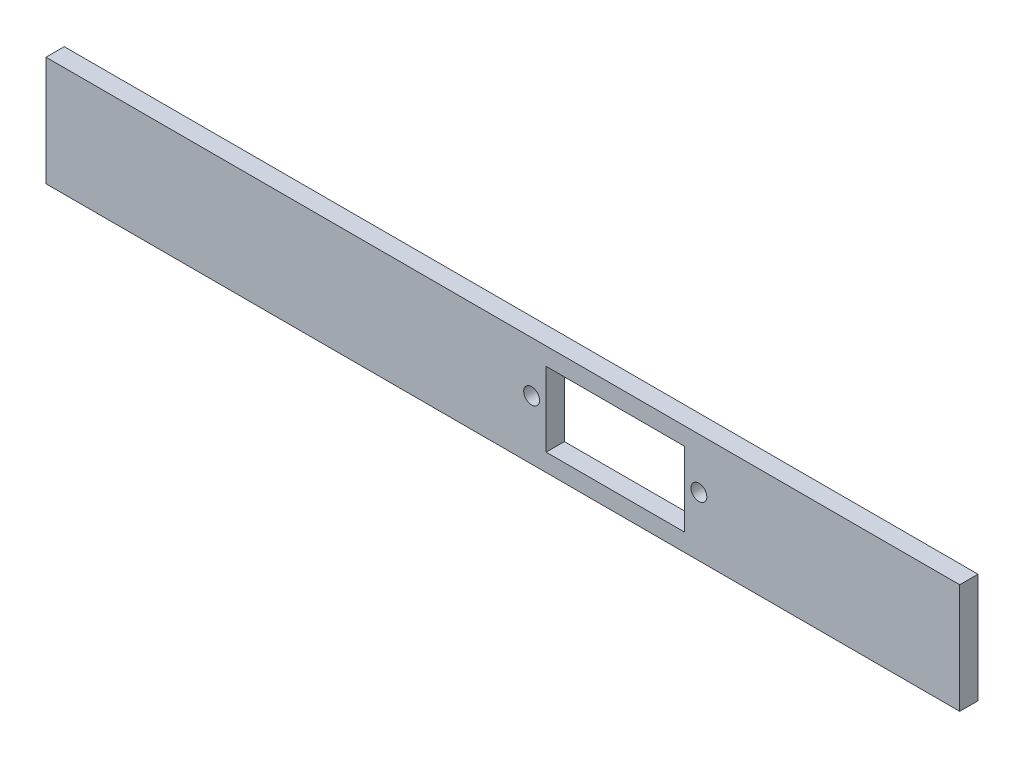
ISO-10303-21;
HEADER;
FILE_DESCRIPTION(('STEP AP214'),'2;1');
FILE_NAME('part.step','',(''),(''),'','','');
FILE_SCHEMA(('AUTOMOTIVE_DESIGN { 1 0 10303 214 1 1 1 1 }'));
ENDSEC;
DATA;
#1=APPLICATION_CONTEXT('core data for automotive mechanical design processes');
#2=APPLICATION_PROTOCOL_DEFINITION('international standard','automotive_design',2000,#1);
#3=PRODUCT_CONTEXT('',#1,'mechanical');
#4=PRODUCT('Part','Part','',(#3));
#5=PRODUCT_RELATED_PRODUCT_CATEGORY('part','',(#4));
#6=PRODUCT_DEFINITION_FORMATION('','',#4);
#7=PRODUCT_DEFINITION_CONTEXT('part definition',#1,'design');
#8=PRODUCT_DEFINITION('design','',#6,#7);
#9=PRODUCT_DEFINITION_SHAPE('','',#8);
#10=(LENGTH_UNIT() NAMED_UNIT(*) SI_UNIT(.MILLI.,.METRE.));
#11=(NAMED_UNIT(*) PLANE_ANGLE_UNIT() SI_UNIT($,.RADIAN.));
#12=(NAMED_UNIT(*) SI_UNIT($,.STERADIAN.) SOLID_ANGLE_UNIT());
#13=UNCERTAINTY_MEASURE_WITH_UNIT(LENGTH_MEASURE(1.E-05),#10,'distance_accuracy_value','');
#14=(GEOMETRIC_REPRESENTATION_CONTEXT(3) GLOBAL_UNCERTAINTY_ASSIGNED_CONTEXT((#13)) GLOBAL_UNIT_ASSIGNED_CONTEXT((#10,
#11,#12)) REPRESENTATION_CONTEXT('',''));
#15=CARTESIAN_POINT('',(0.,0.,0.));
#16=DIRECTION('',(0.,0.,1.));
#17=DIRECTION('',(1.,0.,0.));
#18=AXIS2_PLACEMENT_3D('',#15,#16,#17);
#19=CARTESIAN_POINT('',(75.,9.,3.));
#20=DIRECTION('',(-1.,0.,0.));
#21=DIRECTION('',(0.,0.,1.));
#22=AXIS2_PLACEMENT_3D('',#19,#20,#21);
#23=PLANE('',#22);
#24=DIRECTION('',(0.,1.,0.));
#25=VECTOR('',#24,1.);
#26=CARTESIAN_POINT('',(75.,9.,0.));
#27=LINE('',#26,#25);
#28=CARTESIAN_POINT('',(75.,-9.,0.));
#29=VERTEX_POINT('',#28);
#30=CARTESIAN_POINT('',(75.,9.,0.));
#31=VERTEX_POINT('',#30);
#32=EDGE_CURVE('E138',#29,#31,#27,.T.);
#33=ORIENTED_EDGE('',*,*,#32,.T.);
#34=DIRECTION('',(0.,0.,-1.));
#35=VECTOR('',#34,1.);
#36=CARTESIAN_POINT('',(75.,9.,3.));
#37=LINE('',#36,#35);
#38=CARTESIAN_POINT('',(75.,9.,3.));
#39=VERTEX_POINT('',#38);
#40=EDGE_CURVE('E11',#39,#31,#37,.T.);
#41=ORIENTED_EDGE('',*,*,#40,.F.);
#42=DIRECTION('',(0.,1.,0.));
#43=VECTOR('',#42,1.);
#44=CARTESIAN_POINT('',(75.,9.,3.));
#45=LINE('',#44,#43);
#46=CARTESIAN_POINT('',(75.,-9.,3.));
#47=VERTEX_POINT('',#46);
#48=EDGE_CURVE('E142',#47,#39,#45,.T.);
#49=ORIENTED_EDGE('',*,*,#48,.F.);
#50=DIRECTION('',(0.,0.,-1.));
#51=VECTOR('',#50,1.);
#52=CARTESIAN_POINT('',(75.,-9.,3.));
#53=LINE('',#52,#51);
#54=EDGE_CURVE('E152',#47,#29,#53,.T.);
#55=ORIENTED_EDGE('',*,*,#54,.T.);
#56=EDGE_LOOP('',(#33,#41,#49,#55));
#57=FACE_BOUND('',#56,.T.);
#58=ADVANCED_FACE('F37',(#57),#23,.F.);
#59=CARTESIAN_POINT('',(-75.,9.,3.));
#60=DIRECTION('',(0.,-1.,0.));
#61=DIRECTION('',(0.,0.,-1.));
#62=AXIS2_PLACEMENT_3D('',#59,#60,#61);
#63=PLANE('',#62);
#64=DIRECTION('',(-1.,0.,0.));
#65=VECTOR('',#64,1.);
#66=CARTESIAN_POINT('',(-75.,9.,0.));
#67=LINE('',#66,#65);
#68=CARTESIAN_POINT('',(-75.,9.,0.));
#69=VERTEX_POINT('',#68);
#70=EDGE_CURVE('E155',#31,#69,#67,.T.);
#71=ORIENTED_EDGE('',*,*,#70,.T.);
#72=DIRECTION('',(0.,0.,-1.));
#73=VECTOR('',#72,1.);
#74=CARTESIAN_POINT('',(-75.,9.,3.));
#75=LINE('',#74,#73);
#76=CARTESIAN_POINT('',(-75.,9.,3.));
#77=VERTEX_POINT('',#76);
#78=EDGE_CURVE('E44',#77,#69,#75,.T.);
#79=ORIENTED_EDGE('',*,*,#78,.F.);
#80=DIRECTION('',(-1.,0.,0.));
#81=VECTOR('',#80,1.);
#82=CARTESIAN_POINT('',(-75.,9.,3.));
#83=LINE('',#82,#81);
#84=EDGE_CURVE('E145',#39,#77,#83,.T.);
#85=ORIENTED_EDGE('',*,*,#84,.F.);
#86=ORIENTED_EDGE('',*,*,#40,.T.);
#87=EDGE_LOOP('',(#71,#79,#85,#86));
#88=FACE_BOUND('',#87,.T.);
#89=ADVANCED_FACE('F183',(#88),#63,.F.);
#90=CARTESIAN_POINT('',(-75.,9.,3.));
#91=DIRECTION('',(1.,0.,0.));
#92=DIRECTION('',(0.,0.,-1.));
#93=AXIS2_PLACEMENT_3D('',#90,#91,#92);
#94=PLANE('',#93);
#95=DIRECTION('',(0.,-1.,0.));
#96=VECTOR('',#95,1.);
#97=CARTESIAN_POINT('',(-75.,9.,0.));
#98=LINE('',#97,#96);
#99=CARTESIAN_POINT('',(-75.,-9.,0.));
#100=VERTEX_POINT('',#99);
#101=EDGE_CURVE('E157',#69,#100,#98,.T.);
#102=ORIENTED_EDGE('',*,*,#101,.T.);
#103=DIRECTION('',(0.,0.,-1.));
#104=VECTOR('',#103,1.);
#105=CARTESIAN_POINT('',(-75.,-9.,3.));
#106=LINE('',#105,#104);
#107=CARTESIAN_POINT('',(-75.,-9.,3.));
#108=VERTEX_POINT('',#107);
#109=EDGE_CURVE('E162',#108,#100,#106,.T.);
#110=ORIENTED_EDGE('',*,*,#109,.F.);
#111=DIRECTION('',(0.,-1.,0.));
#112=VECTOR('',#111,1.);
#113=CARTESIAN_POINT('',(-75.,9.,3.));
#114=LINE('',#113,#112);
#115=EDGE_CURVE('E148',#77,#108,#114,.T.);
#116=ORIENTED_EDGE('',*,*,#115,.F.);
#117=ORIENTED_EDGE('',*,*,#78,.T.);
#118=EDGE_LOOP('',(#102,#110,#116,#117));
#119=FACE_BOUND('',#118,.T.);
#120=ADVANCED_FACE('F169',(#119),#94,.F.);
#121=CARTESIAN_POINT('',(-75.,-9.,3.));
#122=DIRECTION('',(0.,1.,0.));
#123=DIRECTION('',(0.,0.,1.));
#124=AXIS2_PLACEMENT_3D('',#121,#122,#123);
#125=PLANE('',#124);
#126=DIRECTION('',(1.,0.,0.));
#127=VECTOR('',#126,1.);
#128=CARTESIAN_POINT('',(-75.,-9.,0.));
#129=LINE('',#128,#127);
#130=EDGE_CURVE('E146',#100,#29,#129,.T.);
#131=ORIENTED_EDGE('',*,*,#130,.T.);
#132=ORIENTED_EDGE('',*,*,#54,.F.);
#133=DIRECTION('',(1.,0.,0.));
#134=VECTOR('',#133,1.);
#135=CARTESIAN_POINT('',(-75.,-9.,3.));
#136=LINE('',#135,#134);
#137=EDGE_CURVE('E150',#108,#47,#136,.T.);
#138=ORIENTED_EDGE('',*,*,#137,.F.);
#139=ORIENTED_EDGE('',*,*,#109,.T.);
#140=EDGE_LOOP('',(#131,#132,#138,#139));
#141=FACE_BOUND('',#140,.T.);
#142=ADVANCED_FACE('F178',(#141),#125,.F.);
#143=CARTESIAN_POINT('',(0.,0.,3.));
#144=DIRECTION('',(0.,0.,1.));
#145=DIRECTION('',(1.,0.,0.));
#146=AXIS2_PLACEMENT_3D('',#143,#144,#145);
#147=PLANE('',#146);
#148=CARTESIAN_POINT('',(32.18,0.723190070905698,3.));
#149=DIRECTION('',(0.,0.,-1.));
#150=DIRECTION('',(-1.,0.,0.));
#151=AXIS2_PLACEMENT_3D('',#148,#149,#150);
#152=CIRCLE('',#151,1.3);
#153=CARTESIAN_POINT('',(30.88,0.723190070905698,3.));
#154=VERTEX_POINT('',#153);
#155=EDGE_CURVE('E132',#154,#154,#152,.T.);
#156=ORIENTED_EDGE('',*,*,#155,.T.);
#157=EDGE_LOOP('',(#156));
#158=FACE_BOUND('',#157,.T.);
#159=CARTESIAN_POINT('',(4.72000000000002,0.723190070905701,3.));
#160=DIRECTION('',(0.,0.,-1.));
#161=DIRECTION('',(1.,0.,0.));
#162=AXIS2_PLACEMENT_3D('',#159,#160,#161);
#163=CIRCLE('',#162,1.3);
#164=CARTESIAN_POINT('',(6.02000000000002,0.723190070905701,3.));
#165=VERTEX_POINT('',#164);
#166=EDGE_CURVE('E225',#165,#165,#163,.T.);
#167=ORIENTED_EDGE('',*,*,#166,.T.);
#168=EDGE_LOOP('',(#167));
#169=FACE_BOUND('',#168,.T.);
#170=DIRECTION('',(0.,-1.,0.));
#171=VECTOR('',#170,1.);
#172=CARTESIAN_POINT('',(29.8,6.1,3.));
#173=LINE('',#172,#171);
#174=CARTESIAN_POINT('',(29.8,6.1,3.));
#175=VERTEX_POINT('',#174);
#176=CARTESIAN_POINT('',(29.8,-6.10000000000001,3.));
#177=VERTEX_POINT('',#176);
#178=EDGE_CURVE('E103',#175,#177,#173,.T.);
#179=ORIENTED_EDGE('',*,*,#178,.T.);
#180=DIRECTION('',(-1.,0.,0.));
#181=VECTOR('',#180,1.);
#182=CARTESIAN_POINT('',(29.8,-6.10000000000001,3.));
#183=LINE('',#182,#181);
#184=CARTESIAN_POINT('',(7.10000000000002,-6.1,3.));
#185=VERTEX_POINT('',#184);
#186=EDGE_CURVE('E112',#177,#185,#183,.T.);
#187=ORIENTED_EDGE('',*,*,#186,.T.);
#188=DIRECTION('',(0.,1.,0.));
#189=VECTOR('',#188,1.);
#190=CARTESIAN_POINT('',(7.10000000000002,6.1,3.));
#191=LINE('',#190,#189);
#192=CARTESIAN_POINT('',(7.10000000000002,6.1,3.));
#193=VERTEX_POINT('',#192);
#194=EDGE_CURVE('E51',#185,#193,#191,.T.);
#195=ORIENTED_EDGE('',*,*,#194,.T.);
#196=DIRECTION('',(1.,0.,0.));
#197=VECTOR('',#196,1.);
#198=CARTESIAN_POINT('',(29.8,6.1,3.));
#199=LINE('',#198,#197);
#200=EDGE_CURVE('E109',#193,#175,#199,.T.);
#201=ORIENTED_EDGE('',*,*,#200,.T.);
#202=EDGE_LOOP('',(#179,#187,#195,#201));
#203=FACE_BOUND('',#202,.T.);
#204=ORIENTED_EDGE('',*,*,#48,.T.);
#205=ORIENTED_EDGE('',*,*,#84,.T.);
#206=ORIENTED_EDGE('',*,*,#115,.T.);
#207=ORIENTED_EDGE('',*,*,#137,.T.);
#208=EDGE_LOOP('',(#204,#205,#206,#207));
#209=FACE_BOUND('',#208,.T.);
#210=ADVANCED_FACE('F116',(#158,#169,#203,#209),#147,.T.);
#211=CARTESIAN_POINT('',(0.,0.,0.));
#212=DIRECTION('',(0.,0.,1.));
#213=DIRECTION('',(1.,0.,0.));
#214=AXIS2_PLACEMENT_3D('',#211,#212,#213);
#215=PLANE('',#214);
#216=CARTESIAN_POINT('',(32.18,0.723190070905698,0.));
#217=DIRECTION('',(0.,0.,-1.));
#218=DIRECTION('',(-1.,0.,0.));
#219=AXIS2_PLACEMENT_3D('',#216,#217,#218);
#220=CIRCLE('',#219,1.3);
#221=CARTESIAN_POINT('',(30.88,0.723190070905698,0.));
#222=VERTEX_POINT('',#221);
#223=EDGE_CURVE('E224',#222,#222,#220,.T.);
#224=ORIENTED_EDGE('',*,*,#223,.F.);
#225=EDGE_LOOP('',(#224));
#226=FACE_BOUND('',#225,.T.);
#227=CARTESIAN_POINT('',(4.72000000000002,0.723190070905701,0.));
#228=DIRECTION('',(0.,0.,-1.));
#229=DIRECTION('',(1.,0.,0.));
#230=AXIS2_PLACEMENT_3D('',#227,#228,#229);
#231=CIRCLE('',#230,1.3);
#232=CARTESIAN_POINT('',(6.02000000000002,0.723190070905701,0.));
#233=VERTEX_POINT('',#232);
#234=EDGE_CURVE('E125',#233,#233,#231,.T.);
#235=ORIENTED_EDGE('',*,*,#234,.F.);
#236=EDGE_LOOP('',(#235));
#237=FACE_BOUND('',#236,.T.);
#238=DIRECTION('',(-1.,0.,0.));
#239=VECTOR('',#238,1.);
#240=CARTESIAN_POINT('',(29.8,-6.10000000000001,0.));
#241=LINE('',#240,#239);
#242=CARTESIAN_POINT('',(29.8,-6.10000000000001,0.));
#243=VERTEX_POINT('',#242);
#244=CARTESIAN_POINT('',(7.10000000000002,-6.1,0.));
#245=VERTEX_POINT('',#244);
#246=EDGE_CURVE('E131',#243,#245,#241,.T.);
#247=ORIENTED_EDGE('',*,*,#246,.F.);
#248=DIRECTION('',(0.,-1.,0.));
#249=VECTOR('',#248,1.);
#250=CARTESIAN_POINT('',(29.8,6.1,0.));
#251=LINE('',#250,#249);
#252=CARTESIAN_POINT('',(29.8,6.1,0.));
#253=VERTEX_POINT('',#252);
#254=EDGE_CURVE('E59',#253,#243,#251,.T.);
#255=ORIENTED_EDGE('',*,*,#254,.F.);
#256=DIRECTION('',(1.,0.,0.));
#257=VECTOR('',#256,1.);
#258=CARTESIAN_POINT('',(29.8,6.1,0.));
#259=LINE('',#258,#257);
#260=CARTESIAN_POINT('',(7.10000000000002,6.1,0.));
#261=VERTEX_POINT('',#260);
#262=EDGE_CURVE('E119',#261,#253,#259,.T.);
#263=ORIENTED_EDGE('',*,*,#262,.F.);
#264=DIRECTION('',(0.,1.,0.));
#265=VECTOR('',#264,1.);
#266=CARTESIAN_POINT('',(7.10000000000002,6.1,0.));
#267=LINE('',#266,#265);
#268=EDGE_CURVE('E122',#245,#261,#267,.T.);
#269=ORIENTED_EDGE('',*,*,#268,.F.);
#270=EDGE_LOOP('',(#247,#255,#263,#269));
#271=FACE_BOUND('',#270,.T.);
#272=ORIENTED_EDGE('',*,*,#32,.F.);
#273=ORIENTED_EDGE('',*,*,#130,.F.);
#274=ORIENTED_EDGE('',*,*,#101,.F.);
#275=ORIENTED_EDGE('',*,*,#70,.F.);
#276=EDGE_LOOP('',(#272,#273,#274,#275));
#277=FACE_BOUND('',#276,.T.);
#278=ADVANCED_FACE('F175',(#226,#237,#271,#277),#215,.F.);
#279=CARTESIAN_POINT('',(29.8,6.1,3.));
#280=DIRECTION('',(1.,0.,0.));
#281=DIRECTION('',(0.,0.,-1.));
#282=AXIS2_PLACEMENT_3D('',#279,#280,#281);
#283=PLANE('',#282);
#284=ORIENTED_EDGE('',*,*,#254,.T.);
#285=DIRECTION('',(0.,0.,-1.));
#286=VECTOR('',#285,1.);
#287=CARTESIAN_POINT('',(29.8,-6.10000000000001,3.));
#288=LINE('',#287,#286);
#289=EDGE_CURVE('E99',#177,#243,#288,.T.);
#290=ORIENTED_EDGE('',*,*,#289,.F.);
#291=ORIENTED_EDGE('',*,*,#178,.F.);
#292=DIRECTION('',(0.,0.,-1.));
#293=VECTOR('',#292,1.);
#294=CARTESIAN_POINT('',(29.8,6.1,3.));
#295=LINE('',#294,#293);
#296=EDGE_CURVE('E136',#175,#253,#295,.T.);
#297=ORIENTED_EDGE('',*,*,#296,.T.);
#298=EDGE_LOOP('',(#284,#290,#291,#297));
#299=FACE_BOUND('',#298,.T.);
#300=ADVANCED_FACE('F101',(#299),#283,.F.);
#301=CARTESIAN_POINT('',(29.8,6.1,3.));
#302=DIRECTION('',(0.,1.,0.));
#303=DIRECTION('',(0.,0.,1.));
#304=AXIS2_PLACEMENT_3D('',#301,#302,#303);
#305=PLANE('',#304);
#306=ORIENTED_EDGE('',*,*,#262,.T.);
#307=ORIENTED_EDGE('',*,*,#296,.F.);
#308=ORIENTED_EDGE('',*,*,#200,.F.);
#309=DIRECTION('',(0.,0.,-1.));
#310=VECTOR('',#309,1.);
#311=CARTESIAN_POINT('',(7.10000000000002,6.1,3.));
#312=LINE('',#311,#310);
#313=EDGE_CURVE('E139',#193,#261,#312,.T.);
#314=ORIENTED_EDGE('',*,*,#313,.T.);
#315=EDGE_LOOP('',(#306,#307,#308,#314));
#316=FACE_BOUND('',#315,.T.);
#317=ADVANCED_FACE('F201',(#316),#305,.F.);
#318=CARTESIAN_POINT('',(7.10000000000002,6.1,3.));
#319=DIRECTION('',(-1.,0.,0.));
#320=DIRECTION('',(0.,0.,1.));
#321=AXIS2_PLACEMENT_3D('',#318,#319,#320);
#322=PLANE('',#321);
#323=ORIENTED_EDGE('',*,*,#268,.T.);
#324=ORIENTED_EDGE('',*,*,#313,.F.);
#325=ORIENTED_EDGE('',*,*,#194,.F.);
#326=DIRECTION('',(0.,0.,-1.));
#327=VECTOR('',#326,1.);
#328=CARTESIAN_POINT('',(7.10000000000002,-6.1,3.));
#329=LINE('',#328,#327);
#330=EDGE_CURVE('E108',#185,#245,#329,.T.);
#331=ORIENTED_EDGE('',*,*,#330,.T.);
#332=EDGE_LOOP('',(#323,#324,#325,#331));
#333=FACE_BOUND('',#332,.T.);
#334=ADVANCED_FACE('F205',(#333),#322,.F.);
#335=CARTESIAN_POINT('',(29.8,-6.10000000000001,3.));
#336=DIRECTION('',(0.,-1.,0.));
#337=DIRECTION('',(1.,0.,0.));
#338=AXIS2_PLACEMENT_3D('',#335,#336,#337);
#339=PLANE('',#338);
#340=ORIENTED_EDGE('',*,*,#246,.T.);
#341=ORIENTED_EDGE('',*,*,#330,.F.);
#342=ORIENTED_EDGE('',*,*,#186,.F.);
#343=ORIENTED_EDGE('',*,*,#289,.T.);
#344=EDGE_LOOP('',(#340,#341,#342,#343));
#345=FACE_BOUND('',#344,.T.);
#346=ADVANCED_FACE('F113',(#345),#339,.F.);
#347=CARTESIAN_POINT('',(4.72000000000002,0.723190070905701,3.));
#348=DIRECTION('',(0.,0.,-1.));
#349=DIRECTION('',(-1.,0.,0.));
#350=AXIS2_PLACEMENT_3D('',#347,#348,#349);
#351=CYLINDRICAL_SURFACE('',#350,1.3);
#352=ORIENTED_EDGE('',*,*,#166,.F.);
#353=EDGE_LOOP('',(#352));
#354=FACE_BOUND('',#353,.T.);
#355=ORIENTED_EDGE('',*,*,#234,.T.);
#356=EDGE_LOOP('',(#355));
#357=FACE_BOUND('',#356,.T.);
#358=ADVANCED_FACE('F204',(#354,#357),#351,.F.);
#359=CARTESIAN_POINT('',(32.18,0.723190070905698,3.));
#360=DIRECTION('',(0.,0.,-1.));
#361=DIRECTION('',(-1.,0.,0.));
#362=AXIS2_PLACEMENT_3D('',#359,#360,#361);
#363=CYLINDRICAL_SURFACE('',#362,1.3);
#364=ORIENTED_EDGE('',*,*,#155,.F.);
#365=EDGE_LOOP('',(#364));
#366=FACE_BOUND('',#365,.T.);
#367=ORIENTED_EDGE('',*,*,#223,.T.);
#368=EDGE_LOOP('',(#367));
#369=FACE_BOUND('',#368,.T.);
#370=ADVANCED_FACE('F213',(#366,#369),#363,.F.);
#371=CLOSED_SHELL('',(#58,#89,#120,#142,#210,#278,#300,#317,#334,#346,#358,#370));
#372=MANIFOLD_SOLID_BREP('B2',#371);
#373=ADVANCED_BREP_SHAPE_REPRESENTATION('',(#18,#372),#14);
#374=SHAPE_DEFINITION_REPRESENTATION(#9,#373);
ENDSEC;
END-ISO-10303-21;
